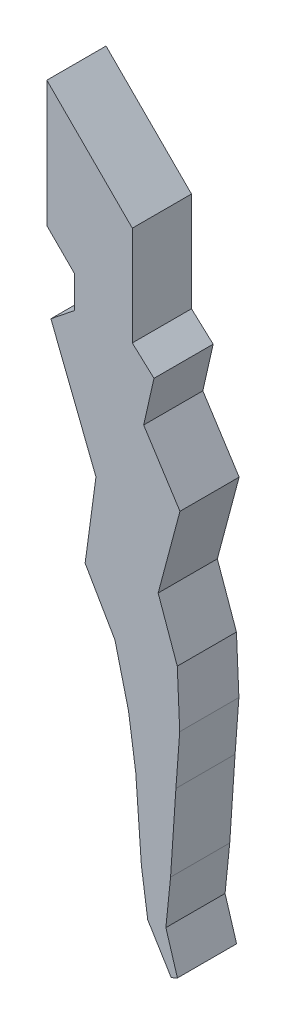
ISO-10303-21;
HEADER;
FILE_DESCRIPTION(('STEP AP214'),'2;1');
FILE_NAME('part.step','',(''),(''),'','','');
FILE_SCHEMA(('AUTOMOTIVE_DESIGN { 1 0 10303 214 1 1 1 1 }'));
ENDSEC;
DATA;
#1=APPLICATION_CONTEXT('core data for automotive mechanical design processes');
#2=APPLICATION_PROTOCOL_DEFINITION('international standard','automotive_design',2000,#1);
#3=PRODUCT_CONTEXT('',#1,'mechanical');
#4=PRODUCT('Part','Part','',(#3));
#5=PRODUCT_RELATED_PRODUCT_CATEGORY('part','',(#4));
#6=PRODUCT_DEFINITION_FORMATION('','',#4);
#7=PRODUCT_DEFINITION_CONTEXT('part definition',#1,'design');
#8=PRODUCT_DEFINITION('design','',#6,#7);
#9=PRODUCT_DEFINITION_SHAPE('','',#8);
#10=(LENGTH_UNIT() NAMED_UNIT(*) SI_UNIT(.MILLI.,.METRE.));
#11=(NAMED_UNIT(*) PLANE_ANGLE_UNIT() SI_UNIT($,.RADIAN.));
#12=(NAMED_UNIT(*) SI_UNIT($,.STERADIAN.) SOLID_ANGLE_UNIT());
#13=UNCERTAINTY_MEASURE_WITH_UNIT(LENGTH_MEASURE(1.E-05),#10,'distance_accuracy_value','');
#14=(GEOMETRIC_REPRESENTATION_CONTEXT(3) GLOBAL_UNCERTAINTY_ASSIGNED_CONTEXT((#13)) GLOBAL_UNIT_ASSIGNED_CONTEXT((#10,
#11,#12)) REPRESENTATION_CONTEXT('',''));
#15=CARTESIAN_POINT('',(0.,0.,0.));
#16=DIRECTION('',(0.,0.,1.));
#17=DIRECTION('',(1.,0.,0.));
#18=AXIS2_PLACEMENT_3D('',#15,#16,#17);
#19=CARTESIAN_POINT('',(4.431541,32.0453696437627,3.));
#20=DIRECTION('',(-0.707106781186548,-0.707106781186547,0.));
#21=DIRECTION('',(0.707106781186547,-0.707106781186548,0.));
#22=AXIS2_PLACEMENT_3D('',#19,#20,#21);
#23=PLANE('',#22);
#24=DIRECTION('',(-0.707106781186547,0.707106781186548,0.));
#25=VECTOR('',#24,1.);
#26=CARTESIAN_POINT('',(4.431541,32.0453696437627,0.));
#27=LINE('',#26,#25);
#28=CARTESIAN_POINT('',(4.431541,32.0453696437627,0.));
#29=VERTEX_POINT('',#28);
#30=CARTESIAN_POINT('',(0.1,36.3769106437627,0.));
#31=VERTEX_POINT('',#30);
#32=EDGE_CURVE('E231',#29,#31,#27,.T.);
#33=ORIENTED_EDGE('',*,*,#32,.T.);
#34=DIRECTION('',(0.,0.,-1.));
#35=VECTOR('',#34,1.);
#36=CARTESIAN_POINT('',(0.1,36.3769106437627,3.));
#37=LINE('',#36,#35);
#38=CARTESIAN_POINT('',(0.1,36.3769106437627,3.));
#39=VERTEX_POINT('',#38);
#40=EDGE_CURVE('E11',#39,#31,#37,.T.);
#41=ORIENTED_EDGE('',*,*,#40,.F.);
#42=DIRECTION('',(-0.707106781186547,0.707106781186548,0.));
#43=VECTOR('',#42,1.);
#44=CARTESIAN_POINT('',(4.431541,32.0453696437627,3.));
#45=LINE('',#44,#43);
#46=CARTESIAN_POINT('',(4.431541,32.0453696437627,3.));
#47=VERTEX_POINT('',#46);
#48=EDGE_CURVE('E279',#47,#39,#45,.T.);
#49=ORIENTED_EDGE('',*,*,#48,.F.);
#50=DIRECTION('',(0.,0.,-1.));
#51=VECTOR('',#50,1.);
#52=CARTESIAN_POINT('',(4.431541,32.0453696437627,3.));
#53=LINE('',#52,#51);
#54=EDGE_CURVE('E227',#47,#29,#53,.T.);
#55=ORIENTED_EDGE('',*,*,#54,.T.);
#56=EDGE_LOOP('',(#33,#41,#49,#55));
#57=FACE_BOUND('',#56,.T.);
#58=ADVANCED_FACE('F33',(#57),#23,.F.);
#59=CARTESIAN_POINT('',(0.1,36.3769106437627,3.));
#60=DIRECTION('',(1.,0.,0.));
#61=DIRECTION('',(0.,0.,-1.));
#62=AXIS2_PLACEMENT_3D('',#59,#60,#61);
#63=PLANE('',#62);
#64=DIRECTION('',(0.,-1.,0.));
#65=VECTOR('',#64,1.);
#66=CARTESIAN_POINT('',(0.1,36.3769106437627,0.));
#67=LINE('',#66,#65);
#68=CARTESIAN_POINT('',(0.1,29.9889453772979,0.));
#69=VERTEX_POINT('',#68);
#70=EDGE_CURVE('E234',#31,#69,#67,.T.);
#71=ORIENTED_EDGE('',*,*,#70,.T.);
#72=DIRECTION('',(0.,0.,-1.));
#73=VECTOR('',#72,1.);
#74=CARTESIAN_POINT('',(0.1,29.9889453772979,3.));
#75=LINE('',#74,#73);
#76=CARTESIAN_POINT('',(0.1,29.9889453772979,3.));
#77=VERTEX_POINT('',#76);
#78=EDGE_CURVE('E41',#77,#69,#75,.T.);
#79=ORIENTED_EDGE('',*,*,#78,.F.);
#80=DIRECTION('',(0.,-1.,0.));
#81=VECTOR('',#80,1.);
#82=CARTESIAN_POINT('',(0.1,36.3769106437627,3.));
#83=LINE('',#82,#81);
#84=EDGE_CURVE('E143',#39,#77,#83,.T.);
#85=ORIENTED_EDGE('',*,*,#84,.F.);
#86=ORIENTED_EDGE('',*,*,#40,.T.);
#87=EDGE_LOOP('',(#71,#79,#85,#86));
#88=FACE_BOUND('',#87,.T.);
#89=ADVANCED_FACE('F422',(#88),#63,.F.);
#90=CARTESIAN_POINT('',(0.1,29.9889453772979,3.));
#91=DIRECTION('',(0.707106526962772,0.707107035410231,0.));
#92=DIRECTION('',(-0.707107035410231,0.707106526962772,0.));
#93=AXIS2_PLACEMENT_3D('',#90,#91,#92);
#94=PLANE('',#93);
#95=DIRECTION('',(0.707107035410231,-0.707106526962772,0.));
#96=VECTOR('',#95,1.);
#97=CARTESIAN_POINT('',(0.1,29.9889453772979,0.));
#98=LINE('',#97,#96);
#99=CARTESIAN_POINT('',(1.490718,28.5982283772979,0.));
#100=VERTEX_POINT('',#99);
#101=EDGE_CURVE('E236',#69,#100,#98,.T.);
#102=ORIENTED_EDGE('',*,*,#101,.T.);
#103=DIRECTION('',(0.,0.,-1.));
#104=VECTOR('',#103,1.);
#105=CARTESIAN_POINT('',(1.490718,28.5982283772979,3.));
#106=LINE('',#105,#104);
#107=CARTESIAN_POINT('',(1.490718,28.5982283772979,3.));
#108=VERTEX_POINT('',#107);
#109=EDGE_CURVE('E337',#108,#100,#106,.T.);
#110=ORIENTED_EDGE('',*,*,#109,.F.);
#111=DIRECTION('',(0.707107035410231,-0.707106526962772,0.));
#112=VECTOR('',#111,1.);
#113=CARTESIAN_POINT('',(0.1,29.9889453772979,3.));
#114=LINE('',#113,#112);
#115=EDGE_CURVE('E345',#77,#108,#114,.T.);
#116=ORIENTED_EDGE('',*,*,#115,.F.);
#117=ORIENTED_EDGE('',*,*,#78,.T.);
#118=EDGE_LOOP('',(#102,#110,#116,#117));
#119=FACE_BOUND('',#118,.T.);
#120=ADVANCED_FACE('F343',(#119),#94,.F.);
#121=CARTESIAN_POINT('',(1.490718,28.5982283772979,3.));
#122=DIRECTION('',(1.,0.,0.));
#123=DIRECTION('',(0.,0.,-1.));
#124=AXIS2_PLACEMENT_3D('',#121,#122,#123);
#125=PLANE('',#124);
#126=DIRECTION('',(0.,-1.,0.));
#127=VECTOR('',#126,1.);
#128=CARTESIAN_POINT('',(1.490718,28.5982283772979,0.));
#129=LINE('',#128,#127);
#130=CARTESIAN_POINT('',(1.490718,26.9555668146788,0.));
#131=VERTEX_POINT('',#130);
#132=EDGE_CURVE('E238',#100,#131,#129,.T.);
#133=ORIENTED_EDGE('',*,*,#132,.T.);
#134=DIRECTION('',(0.,0.,-1.));
#135=VECTOR('',#134,1.);
#136=CARTESIAN_POINT('',(1.490718,26.9555668146788,3.));
#137=LINE('',#136,#135);
#138=CARTESIAN_POINT('',(1.490718,26.9555668146788,3.));
#139=VERTEX_POINT('',#138);
#140=EDGE_CURVE('E334',#139,#131,#137,.T.);
#141=ORIENTED_EDGE('',*,*,#140,.F.);
#142=DIRECTION('',(0.,-1.,0.));
#143=VECTOR('',#142,1.);
#144=CARTESIAN_POINT('',(1.490718,28.5982283772979,3.));
#145=LINE('',#144,#143);
#146=EDGE_CURVE('E363',#108,#139,#145,.T.);
#147=ORIENTED_EDGE('',*,*,#146,.F.);
#148=ORIENTED_EDGE('',*,*,#109,.T.);
#149=EDGE_LOOP('',(#133,#141,#147,#148));
#150=FACE_BOUND('',#149,.T.);
#151=ADVANCED_FACE('F354',(#150),#125,.F.);
#152=CARTESIAN_POINT('',(1.490718,26.9555668146788,3.));
#153=DIRECTION('',(0.625256998029095,-0.780418917258958,0.));
#154=DIRECTION('',(0.780418917258958,0.625256998029095,0.));
#155=AXIS2_PLACEMENT_3D('',#152,#153,#154);
#156=PLANE('',#155);
#157=DIRECTION('',(-0.780418917258958,-0.625256998029095,0.));
#158=VECTOR('',#157,1.);
#159=CARTESIAN_POINT('',(1.490718,26.9555668146788,0.));
#160=LINE('',#159,#158);
#161=CARTESIAN_POINT('',(0.305264988929706,26.0058040979962,0.));
#162=VERTEX_POINT('',#161);
#163=EDGE_CURVE('E240',#131,#162,#160,.T.);
#164=ORIENTED_EDGE('',*,*,#163,.T.);
#165=DIRECTION('',(0.,0.,-1.));
#166=VECTOR('',#165,1.);
#167=CARTESIAN_POINT('',(0.305264988929706,26.0058040979962,3.));
#168=LINE('',#167,#166);
#169=CARTESIAN_POINT('',(0.305264988929706,26.0058040979962,3.));
#170=VERTEX_POINT('',#169);
#171=EDGE_CURVE('E331',#170,#162,#168,.T.);
#172=ORIENTED_EDGE('',*,*,#171,.F.);
#173=DIRECTION('',(-0.780418917258958,-0.625256998029095,0.));
#174=VECTOR('',#173,1.);
#175=CARTESIAN_POINT('',(1.490718,26.9555668146788,3.));
#176=LINE('',#175,#174);
#177=EDGE_CURVE('E360',#139,#170,#176,.T.);
#178=ORIENTED_EDGE('',*,*,#177,.F.);
#179=ORIENTED_EDGE('',*,*,#140,.T.);
#180=EDGE_LOOP('',(#164,#172,#178,#179));
#181=FACE_BOUND('',#180,.T.);
#182=ADVANCED_FACE('F358',(#181),#156,.F.);
#183=CARTESIAN_POINT('',(0.305264988929706,26.0058040979962,3.));
#184=DIRECTION('',(0.930448288246611,0.366423229202177,0.));
#185=DIRECTION('',(-0.366423229202177,0.930448288246611,0.));
#186=AXIS2_PLACEMENT_3D('',#183,#184,#185);
#187=PLANE('',#186);
#188=DIRECTION('',(0.366423229202177,-0.930448288246611,0.));
#189=VECTOR('',#188,1.);
#190=CARTESIAN_POINT('',(0.305264988929706,26.0058040979962,0.));
#191=LINE('',#190,#189);
#192=CARTESIAN_POINT('',(2.58967106331305,20.2050754536958,0.));
#193=VERTEX_POINT('',#192);
#194=EDGE_CURVE('E242',#162,#193,#191,.T.);
#195=ORIENTED_EDGE('',*,*,#194,.T.);
#196=DIRECTION('',(0.,0.,-1.));
#197=VECTOR('',#196,1.);
#198=CARTESIAN_POINT('',(2.58967106331305,20.2050754536958,3.));
#199=LINE('',#198,#197);
#200=CARTESIAN_POINT('',(2.58967106331305,20.2050754536958,3.));
#201=VERTEX_POINT('',#200);
#202=EDGE_CURVE('E328',#201,#193,#199,.T.);
#203=ORIENTED_EDGE('',*,*,#202,.F.);
#204=DIRECTION('',(0.366423229202177,-0.930448288246611,0.));
#205=VECTOR('',#204,1.);
#206=CARTESIAN_POINT('',(0.305264988929706,26.0058040979962,3.));
#207=LINE('',#206,#205);
#208=EDGE_CURVE('E362',#170,#201,#207,.T.);
#209=ORIENTED_EDGE('',*,*,#208,.F.);
#210=ORIENTED_EDGE('',*,*,#171,.T.);
#211=EDGE_LOOP('',(#195,#203,#209,#210));
#212=FACE_BOUND('',#211,.T.);
#213=ADVANCED_FACE('F435',(#212),#187,.F.);
#214=CARTESIAN_POINT('',(2.58967106331305,20.2050754536958,3.));
#215=DIRECTION('',(0.990981389360942,-0.13399957440327,0.));
#216=DIRECTION('',(0.13399957440327,0.990981389360942,0.));
#217=AXIS2_PLACEMENT_3D('',#214,#215,#216);
#218=PLANE('',#217);
#219=DIRECTION('',(-0.13399957440327,-0.990981389360942,0.));
#220=VECTOR('',#219,1.);
#221=CARTESIAN_POINT('',(2.58967106331305,20.2050754536958,0.));
#222=LINE('',#221,#220);
#223=CARTESIAN_POINT('',(2.04009924758499,16.1407682054892,0.));
#224=VERTEX_POINT('',#223);
#225=EDGE_CURVE('E244',#193,#224,#222,.T.);
#226=ORIENTED_EDGE('',*,*,#225,.T.);
#227=DIRECTION('',(0.,0.,-1.));
#228=VECTOR('',#227,1.);
#229=CARTESIAN_POINT('',(2.04009924758499,16.1407682054892,3.));
#230=LINE('',#229,#228);
#231=CARTESIAN_POINT('',(2.04009924758499,16.1407682054892,3.));
#232=VERTEX_POINT('',#231);
#233=EDGE_CURVE('E325',#232,#224,#230,.T.);
#234=ORIENTED_EDGE('',*,*,#233,.F.);
#235=DIRECTION('',(-0.13399957440327,-0.990981389360942,0.));
#236=VECTOR('',#235,1.);
#237=CARTESIAN_POINT('',(2.58967106331305,20.2050754536958,3.));
#238=LINE('',#237,#236);
#239=EDGE_CURVE('E365',#201,#232,#238,.T.);
#240=ORIENTED_EDGE('',*,*,#239,.F.);
#241=ORIENTED_EDGE('',*,*,#202,.T.);
#242=EDGE_LOOP('',(#226,#234,#240,#241));
#243=FACE_BOUND('',#242,.T.);
#244=ADVANCED_FACE('F438',(#243),#218,.F.);
#245=CARTESIAN_POINT('',(2.04009924758499,16.1407682054892,3.));
#246=DIRECTION('',(0.865608287412153,0.500721771808856,0.));
#247=DIRECTION('',(-0.500721771808856,0.865608287412153,0.));
#248=AXIS2_PLACEMENT_3D('',#245,#246,#247);
#249=PLANE('',#248);
#250=DIRECTION('',(0.500721771808856,-0.865608287412153,0.));
#251=VECTOR('',#250,1.);
#252=CARTESIAN_POINT('',(2.04009924758499,16.1407682054892,0.));
#253=LINE('',#252,#251);
#254=CARTESIAN_POINT('',(3.55196525050998,13.5271735601816,0.));
#255=VERTEX_POINT('',#254);
#256=EDGE_CURVE('E246',#224,#255,#253,.T.);
#257=ORIENTED_EDGE('',*,*,#256,.T.);
#258=DIRECTION('',(0.,0.,-1.));
#259=VECTOR('',#258,1.);
#260=CARTESIAN_POINT('',(3.55196525050998,13.5271735601816,3.));
#261=LINE('',#260,#259);
#262=CARTESIAN_POINT('',(3.55196525050998,13.5271735601816,3.));
#263=VERTEX_POINT('',#262);
#264=EDGE_CURVE('E322',#263,#255,#261,.T.);
#265=ORIENTED_EDGE('',*,*,#264,.F.);
#266=DIRECTION('',(0.500721771808856,-0.865608287412153,0.));
#267=VECTOR('',#266,1.);
#268=CARTESIAN_POINT('',(2.04009924758499,16.1407682054892,3.));
#269=LINE('',#268,#267);
#270=EDGE_CURVE('E371',#232,#263,#269,.T.);
#271=ORIENTED_EDGE('',*,*,#270,.F.);
#272=ORIENTED_EDGE('',*,*,#233,.T.);
#273=EDGE_LOOP('',(#257,#265,#271,#272));
#274=FACE_BOUND('',#273,.T.);
#275=ADVANCED_FACE('F442',(#274),#249,.F.);
#276=CARTESIAN_POINT('',(3.55196525050998,13.5271735601816,3.));
#277=DIRECTION('',(0.970484456484513,0.241163678280873,0.));
#278=DIRECTION('',(-0.241163678280873,0.970484456484513,0.));
#279=AXIS2_PLACEMENT_3D('',#276,#277,#278);
#280=PLANE('',#279);
#281=DIRECTION('',(0.241163678280873,-0.970484456484512,0.));
#282=VECTOR('',#281,1.);
#283=CARTESIAN_POINT('',(3.55196525050998,13.5271735601816,0.));
#284=LINE('',#283,#282);
#285=CARTESIAN_POINT('',(4.24063457657345,10.7558487845498,0.));
#286=VERTEX_POINT('',#285);
#287=EDGE_CURVE('E248',#255,#286,#284,.T.);
#288=ORIENTED_EDGE('',*,*,#287,.T.);
#289=DIRECTION('',(0.,0.,-1.));
#290=VECTOR('',#289,1.);
#291=CARTESIAN_POINT('',(4.24063457657345,10.7558487845498,3.));
#292=LINE('',#291,#290);
#293=CARTESIAN_POINT('',(4.24063457657345,10.7558487845498,3.));
#294=VERTEX_POINT('',#293);
#295=EDGE_CURVE('E319',#294,#286,#292,.T.);
#296=ORIENTED_EDGE('',*,*,#295,.F.);
#297=DIRECTION('',(0.241163678280873,-0.970484456484512,0.));
#298=VECTOR('',#297,1.);
#299=CARTESIAN_POINT('',(3.55196525050998,13.5271735601816,3.));
#300=LINE('',#299,#298);
#301=EDGE_CURVE('E373',#263,#294,#300,.T.);
#302=ORIENTED_EDGE('',*,*,#301,.F.);
#303=ORIENTED_EDGE('',*,*,#264,.T.);
#304=EDGE_LOOP('',(#288,#296,#302,#303));
#305=FACE_BOUND('',#304,.T.);
#306=ADVANCED_FACE('F446',(#305),#280,.F.);
#307=CARTESIAN_POINT('',(4.24063457657345,10.7558487845498,3.));
#308=DIRECTION('',(0.989656647554641,0.143456334648939,0.));
#309=DIRECTION('',(-0.143456334648939,0.989656647554642,0.));
#310=AXIS2_PLACEMENT_3D('',#307,#308,#309);
#311=PLANE('',#310);
#312=DIRECTION('',(0.143456334648939,-0.989656647554641,0.));
#313=VECTOR('',#312,1.);
#314=CARTESIAN_POINT('',(4.24063457657345,10.7558487845498,0.));
#315=LINE('',#314,#313);
#316=CARTESIAN_POINT('',(4.60621300008909,8.23384710424643,0.));
#317=VERTEX_POINT('',#316);
#318=EDGE_CURVE('E250',#286,#317,#315,.T.);
#319=ORIENTED_EDGE('',*,*,#318,.T.);
#320=DIRECTION('',(0.,0.,-1.));
#321=VECTOR('',#320,1.);
#322=CARTESIAN_POINT('',(4.60621300008909,8.23384710424643,3.));
#323=LINE('',#322,#321);
#324=CARTESIAN_POINT('',(4.60621300008909,8.23384710424643,3.));
#325=VERTEX_POINT('',#324);
#326=EDGE_CURVE('E316',#325,#317,#323,.T.);
#327=ORIENTED_EDGE('',*,*,#326,.F.);
#328=DIRECTION('',(0.143456334648939,-0.989656647554641,0.));
#329=VECTOR('',#328,1.);
#330=CARTESIAN_POINT('',(4.24063457657345,10.7558487845498,3.));
#331=LINE('',#330,#329);
#332=EDGE_CURVE('E375',#294,#325,#331,.T.);
#333=ORIENTED_EDGE('',*,*,#332,.F.);
#334=ORIENTED_EDGE('',*,*,#295,.T.);
#335=EDGE_LOOP('',(#319,#327,#333,#334));
#336=FACE_BOUND('',#335,.T.);
#337=ADVANCED_FACE('F450',(#336),#311,.F.);
#338=CARTESIAN_POINT('',(4.60621300008909,8.23384710424643,3.));
#339=DIRECTION('',(0.997358865679586,0.0726312126453135,0.));
#340=DIRECTION('',(-0.0726312126453135,0.997358865679586,0.));
#341=AXIS2_PLACEMENT_3D('',#338,#339,#340);
#342=PLANE('',#341);
#343=DIRECTION('',(0.0726312126453135,-0.997358865679586,0.));
#344=VECTOR('',#343,1.);
#345=CARTESIAN_POINT('',(4.60621300008909,8.23384710424643,0.));
#346=LINE('',#345,#344);
#347=CARTESIAN_POINT('',(4.89394744160751,4.28272904139407,0.));
#348=VERTEX_POINT('',#347);
#349=EDGE_CURVE('E252',#317,#348,#346,.T.);
#350=ORIENTED_EDGE('',*,*,#349,.T.);
#351=DIRECTION('',(0.,0.,-1.));
#352=VECTOR('',#351,1.);
#353=CARTESIAN_POINT('',(4.89394744160751,4.28272904139407,3.));
#354=LINE('',#353,#352);
#355=CARTESIAN_POINT('',(4.89394744160751,4.28272904139407,3.));
#356=VERTEX_POINT('',#355);
#357=EDGE_CURVE('E313',#356,#348,#354,.T.);
#358=ORIENTED_EDGE('',*,*,#357,.F.);
#359=DIRECTION('',(0.0726312126453135,-0.997358865679586,0.));
#360=VECTOR('',#359,1.);
#361=CARTESIAN_POINT('',(4.60621300008909,8.23384710424643,3.));
#362=LINE('',#361,#360);
#363=EDGE_CURVE('E377',#325,#356,#362,.T.);
#364=ORIENTED_EDGE('',*,*,#363,.F.);
#365=ORIENTED_EDGE('',*,*,#326,.T.);
#366=EDGE_LOOP('',(#350,#358,#364,#365));
#367=FACE_BOUND('',#366,.T.);
#368=ADVANCED_FACE('F454',(#367),#342,.F.);
#369=CARTESIAN_POINT('',(4.89394744160751,4.28272904139407,3.));
#370=DIRECTION('',(0.989674059321828,0.143336165378648,0.));
#371=DIRECTION('',(-0.143336165378648,0.989674059321828,0.));
#372=AXIS2_PLACEMENT_3D('',#369,#370,#371);
#373=PLANE('',#372);
#374=DIRECTION('',(0.143336165378648,-0.989674059321828,0.));
#375=VECTOR('',#374,1.);
#376=CARTESIAN_POINT('',(4.89394744160751,4.28272904139407,0.));
#377=LINE('',#376,#375);
#378=CARTESIAN_POINT('',(5.21405761551797,2.07250711723916,0.));
#379=VERTEX_POINT('',#378);
#380=EDGE_CURVE('E254',#348,#379,#377,.T.);
#381=ORIENTED_EDGE('',*,*,#380,.T.);
#382=DIRECTION('',(0.,0.,-1.));
#383=VECTOR('',#382,1.);
#384=CARTESIAN_POINT('',(5.21405761551797,2.07250711723916,3.));
#385=LINE('',#384,#383);
#386=CARTESIAN_POINT('',(5.21405761551797,2.07250711723916,3.));
#387=VERTEX_POINT('',#386);
#388=EDGE_CURVE('E310',#387,#379,#385,.T.);
#389=ORIENTED_EDGE('',*,*,#388,.F.);
#390=DIRECTION('',(0.143336165378648,-0.989674059321828,0.));
#391=VECTOR('',#390,1.);
#392=CARTESIAN_POINT('',(4.89394744160751,4.28272904139407,3.));
#393=LINE('',#392,#391);
#394=EDGE_CURVE('E379',#356,#387,#393,.T.);
#395=ORIENTED_EDGE('',*,*,#394,.F.);
#396=ORIENTED_EDGE('',*,*,#357,.T.);
#397=EDGE_LOOP('',(#381,#389,#395,#396));
#398=FACE_BOUND('',#397,.T.);
#399=ADVANCED_FACE('F458',(#398),#373,.F.);
#400=CARTESIAN_POINT('',(5.21405761551797,2.07250711723916,3.));
#401=DIRECTION('',(0.853002136465464,0.52190742012866,0.));
#402=DIRECTION('',(-0.52190742012866,0.853002136465465,0.));
#403=AXIS2_PLACEMENT_3D('',#400,#401,#402);
#404=PLANE('',#403);
#405=DIRECTION('',(0.52190742012866,-0.853002136465464,0.));
#406=VECTOR('',#405,1.);
#407=CARTESIAN_POINT('',(5.21405761551797,2.07250711723916,0.));
#408=LINE('',#407,#406);
#409=CARTESIAN_POINT('',(6.40407987921905,0.127542370180668,0.));
#410=VERTEX_POINT('',#409);
#411=EDGE_CURVE('E256',#379,#410,#408,.T.);
#412=ORIENTED_EDGE('',*,*,#411,.T.);
#413=DIRECTION('',(0.,0.,-1.));
#414=VECTOR('',#413,1.);
#415=CARTESIAN_POINT('',(6.40407987921905,0.127542370180668,3.));
#416=LINE('',#415,#414);
#417=CARTESIAN_POINT('',(6.40407987921905,0.127542370180668,3.));
#418=VERTEX_POINT('',#417);
#419=EDGE_CURVE('E307',#418,#410,#416,.T.);
#420=ORIENTED_EDGE('',*,*,#419,.F.);
#421=DIRECTION('',(0.52190742012866,-0.853002136465464,0.));
#422=VECTOR('',#421,1.);
#423=CARTESIAN_POINT('',(5.21405761551797,2.07250711723916,3.));
#424=LINE('',#423,#422);
#425=EDGE_CURVE('E381',#387,#418,#424,.T.);
#426=ORIENTED_EDGE('',*,*,#425,.F.);
#427=ORIENTED_EDGE('',*,*,#388,.T.);
#428=EDGE_LOOP('',(#412,#420,#426,#427));
#429=FACE_BOUND('',#428,.T.);
#430=ADVANCED_FACE('F462',(#429),#404,.F.);
#431=CARTESIAN_POINT('',(6.40407987921905,0.127542370180668,3.));
#432=DIRECTION('',(-0.412688749506975,0.910872107395088,0.));
#433=DIRECTION('',(-0.910872107395088,-0.412688749506975,0.));
#434=AXIS2_PLACEMENT_3D('',#431,#432,#433);
#435=PLANE('',#434);
#436=DIRECTION('',(0.910872107395089,0.412688749506975,0.));
#437=VECTOR('',#436,1.);
#438=CARTESIAN_POINT('',(6.40407987921905,0.127542370180668,0.));
#439=LINE('',#438,#437);
#440=CARTESIAN_POINT('',(6.71930092959634,0.270359545108228,0.));
#441=VERTEX_POINT('',#440);
#442=EDGE_CURVE('E258',#410,#441,#439,.T.);
#443=ORIENTED_EDGE('',*,*,#442,.T.);
#444=DIRECTION('',(0.,0.,-1.));
#445=VECTOR('',#444,1.);
#446=CARTESIAN_POINT('',(6.71930092959634,0.270359545108228,3.));
#447=LINE('',#446,#445);
#448=CARTESIAN_POINT('',(6.71930092959634,0.270359545108228,3.));
#449=VERTEX_POINT('',#448);
#450=EDGE_CURVE('E304',#449,#441,#447,.T.);
#451=ORIENTED_EDGE('',*,*,#450,.F.);
#452=DIRECTION('',(0.910872107395089,0.412688749506975,0.));
#453=VECTOR('',#452,1.);
#454=CARTESIAN_POINT('',(6.40407987921905,0.127542370180668,3.));
#455=LINE('',#454,#453);
#456=EDGE_CURVE('E383',#418,#449,#455,.T.);
#457=ORIENTED_EDGE('',*,*,#456,.F.);
#458=ORIENTED_EDGE('',*,*,#419,.T.);
#459=EDGE_LOOP('',(#443,#451,#457,#458));
#460=FACE_BOUND('',#459,.T.);
#461=ADVANCED_FACE('F466',(#460),#435,.F.);
#462=CARTESIAN_POINT('',(6.71930092959634,0.270359545108228,3.));
#463=DIRECTION('',(-0.95647743048352,-0.291806314146289,0.));
#464=DIRECTION('',(0.291806314146289,-0.95647743048352,0.));
#465=AXIS2_PLACEMENT_3D('',#462,#463,#464);
#466=PLANE('',#465);
#467=DIRECTION('',(-0.291806314146289,0.95647743048352,0.));
#468=VECTOR('',#467,1.);
#469=CARTESIAN_POINT('',(6.71930092959634,0.270359545108228,0.));
#470=LINE('',#469,#468);
#471=CARTESIAN_POINT('',(6.13382696619427,2.18941545645182,0.));
#472=VERTEX_POINT('',#471);
#473=EDGE_CURVE('E260',#441,#472,#470,.T.);
#474=ORIENTED_EDGE('',*,*,#473,.T.);
#475=DIRECTION('',(0.,0.,-1.));
#476=VECTOR('',#475,1.);
#477=CARTESIAN_POINT('',(6.13382696619427,2.18941545645182,3.));
#478=LINE('',#477,#476);
#479=CARTESIAN_POINT('',(6.13382696619427,2.18941545645182,3.));
#480=VERTEX_POINT('',#479);
#481=EDGE_CURVE('E301',#480,#472,#478,.T.);
#482=ORIENTED_EDGE('',*,*,#481,.F.);
#483=DIRECTION('',(-0.291806314146289,0.95647743048352,0.));
#484=VECTOR('',#483,1.);
#485=CARTESIAN_POINT('',(6.71930092959634,0.270359545108228,3.));
#486=LINE('',#485,#484);
#487=EDGE_CURVE('E385',#449,#480,#486,.T.);
#488=ORIENTED_EDGE('',*,*,#487,.F.);
#489=ORIENTED_EDGE('',*,*,#450,.T.);
#490=EDGE_LOOP('',(#474,#482,#488,#489));
#491=FACE_BOUND('',#490,.T.);
#492=ADVANCED_FACE('F470',(#491),#466,.F.);
#493=CARTESIAN_POINT('',(6.13382696619427,2.18941545645182,3.));
#494=DIRECTION('',(-0.994897875856503,0.100887147923902,0.));
#495=DIRECTION('',(-0.100887147923902,-0.994897875856503,0.));
#496=AXIS2_PLACEMENT_3D('',#493,#494,#495);
#497=PLANE('',#496);
#498=DIRECTION('',(0.100887147923902,0.994897875856502,0.));
#499=VECTOR('',#498,1.);
#500=CARTESIAN_POINT('',(6.13382696619427,2.18941545645182,0.));
#501=LINE('',#500,#499);
#502=CARTESIAN_POINT('',(6.37050423284627,4.52340660102472,0.));
#503=VERTEX_POINT('',#502);
#504=EDGE_CURVE('E262',#472,#503,#501,.T.);
#505=ORIENTED_EDGE('',*,*,#504,.T.);
#506=DIRECTION('',(0.,0.,-1.));
#507=VECTOR('',#506,1.);
#508=CARTESIAN_POINT('',(6.37050423284627,4.52340660102472,3.));
#509=LINE('',#508,#507);
#510=CARTESIAN_POINT('',(6.37050423284627,4.52340660102472,3.));
#511=VERTEX_POINT('',#510);
#512=EDGE_CURVE('E298',#511,#503,#509,.T.);
#513=ORIENTED_EDGE('',*,*,#512,.F.);
#514=DIRECTION('',(0.100887147923902,0.994897875856502,0.));
#515=VECTOR('',#514,1.);
#516=CARTESIAN_POINT('',(6.13382696619427,2.18941545645182,3.));
#517=LINE('',#516,#515);
#518=EDGE_CURVE('E387',#480,#511,#517,.T.);
#519=ORIENTED_EDGE('',*,*,#518,.F.);
#520=ORIENTED_EDGE('',*,*,#481,.T.);
#521=EDGE_LOOP('',(#505,#513,#519,#520));
#522=FACE_BOUND('',#521,.T.);
#523=ADVANCED_FACE('F474',(#522),#497,.F.);
#524=CARTESIAN_POINT('',(6.37050423284627,4.52340660102472,3.));
#525=DIRECTION('',(-0.997745137571752,0.0671166182992415,0.));
#526=DIRECTION('',(-0.0671166182992415,-0.997745137571752,0.));
#527=AXIS2_PLACEMENT_3D('',#524,#525,#526);
#528=PLANE('',#527);
#529=DIRECTION('',(0.0671166182992415,0.997745137571752,0.));
#530=VECTOR('',#529,1.);
#531=CARTESIAN_POINT('',(6.37050423284627,4.52340660102472,0.));
#532=LINE('',#531,#530);
#533=CARTESIAN_POINT('',(6.64161357550973,8.55367563494288,0.));
#534=VERTEX_POINT('',#533);
#535=EDGE_CURVE('E264',#503,#534,#532,.T.);
#536=ORIENTED_EDGE('',*,*,#535,.T.);
#537=DIRECTION('',(0.,0.,-1.));
#538=VECTOR('',#537,1.);
#539=CARTESIAN_POINT('',(6.64161357550973,8.55367563494288,3.));
#540=LINE('',#539,#538);
#541=CARTESIAN_POINT('',(6.64161357550973,8.55367563494288,3.));
#542=VERTEX_POINT('',#541);
#543=EDGE_CURVE('E295',#542,#534,#540,.T.);
#544=ORIENTED_EDGE('',*,*,#543,.F.);
#545=DIRECTION('',(0.0671166182992415,0.997745137571752,0.));
#546=VECTOR('',#545,1.);
#547=CARTESIAN_POINT('',(6.37050423284627,4.52340660102472,3.));
#548=LINE('',#547,#546);
#549=EDGE_CURVE('E389',#511,#542,#548,.T.);
#550=ORIENTED_EDGE('',*,*,#549,.F.);
#551=ORIENTED_EDGE('',*,*,#512,.T.);
#552=EDGE_LOOP('',(#536,#544,#550,#551));
#553=FACE_BOUND('',#552,.T.);
#554=ADVANCED_FACE('F478',(#553),#528,.F.);
#555=CARTESIAN_POINT('',(6.64161357550973,8.55367563494288,3.));
#556=DIRECTION('',(-0.997215474970495,0.0745741005937689,0.));
#557=DIRECTION('',(-0.0745741005937689,-0.997215474970495,0.));
#558=AXIS2_PLACEMENT_3D('',#555,#556,#557);
#559=PLANE('',#558);
#560=DIRECTION('',(0.0745741005937689,0.997215474970495,0.));
#561=VECTOR('',#560,1.);
#562=CARTESIAN_POINT('',(6.64161357550973,8.55367563494288,0.));
#563=LINE('',#562,#561);
#564=CARTESIAN_POINT('',(6.83522607422338,11.1426894926721,0.));
#565=VERTEX_POINT('',#564);
#566=EDGE_CURVE('E266',#534,#565,#563,.T.);
#567=ORIENTED_EDGE('',*,*,#566,.T.);
#568=DIRECTION('',(0.,0.,-1.));
#569=VECTOR('',#568,1.);
#570=CARTESIAN_POINT('',(6.83522607422338,11.1426894926721,3.));
#571=LINE('',#570,#569);
#572=CARTESIAN_POINT('',(6.83522607422338,11.1426894926721,3.));
#573=VERTEX_POINT('',#572);
#574=EDGE_CURVE('E292',#573,#565,#571,.T.);
#575=ORIENTED_EDGE('',*,*,#574,.F.);
#576=DIRECTION('',(0.0745741005937689,0.997215474970495,0.));
#577=VECTOR('',#576,1.);
#578=CARTESIAN_POINT('',(6.64161357550973,8.55367563494288,3.));
#579=LINE('',#578,#577);
#580=EDGE_CURVE('E391',#542,#573,#579,.T.);
#581=ORIENTED_EDGE('',*,*,#580,.F.);
#582=ORIENTED_EDGE('',*,*,#543,.T.);
#583=EDGE_LOOP('',(#567,#575,#581,#582));
#584=FACE_BOUND('',#583,.T.);
#585=ADVANCED_FACE('F482',(#584),#559,.F.);
#586=CARTESIAN_POINT('',(6.83522607422338,11.1426894926721,3.));
#587=DIRECTION('',(-0.999026595198034,-0.0441119268115097,0.));
#588=DIRECTION('',(0.0441119268115098,-0.999026595198034,0.));
#589=AXIS2_PLACEMENT_3D('',#586,#587,#588);
#590=PLANE('',#589);
#591=DIRECTION('',(-0.0441119268115097,0.999026595198034,0.));
#592=VECTOR('',#591,1.);
#593=CARTESIAN_POINT('',(6.83522607422338,11.1426894926721,0.));
#594=LINE('',#593,#592);
#595=CARTESIAN_POINT('',(6.71102282061841,13.9555875574447,0.));
#596=VERTEX_POINT('',#595);
#597=EDGE_CURVE('E268',#565,#596,#594,.T.);
#598=ORIENTED_EDGE('',*,*,#597,.T.);
#599=DIRECTION('',(0.,0.,-1.));
#600=VECTOR('',#599,1.);
#601=CARTESIAN_POINT('',(6.71102282061841,13.9555875574447,3.));
#602=LINE('',#601,#600);
#603=CARTESIAN_POINT('',(6.71102282061841,13.9555875574447,3.));
#604=VERTEX_POINT('',#603);
#605=EDGE_CURVE('E289',#604,#596,#602,.T.);
#606=ORIENTED_EDGE('',*,*,#605,.F.);
#607=DIRECTION('',(-0.0441119268115097,0.999026595198034,0.));
#608=VECTOR('',#607,1.);
#609=CARTESIAN_POINT('',(6.83522607422338,11.1426894926721,3.));
#610=LINE('',#609,#608);
#611=EDGE_CURVE('E393',#573,#604,#610,.T.);
#612=ORIENTED_EDGE('',*,*,#611,.F.);
#613=ORIENTED_EDGE('',*,*,#574,.T.);
#614=EDGE_LOOP('',(#598,#606,#612,#613));
#615=FACE_BOUND('',#614,.T.);
#616=ADVANCED_FACE('F486',(#615),#590,.F.);
#617=CARTESIAN_POINT('',(6.71102282061841,13.9555875574447,3.));
#618=DIRECTION('',(-0.942295373982806,-0.334782658109113,0.));
#619=DIRECTION('',(0.334782658109113,-0.942295373982806,0.));
#620=AXIS2_PLACEMENT_3D('',#617,#618,#619);
#621=PLANE('',#620);
#622=DIRECTION('',(-0.334782658109113,0.942295373982806,0.));
#623=VECTOR('',#622,1.);
#624=CARTESIAN_POINT('',(6.71102282061841,13.9555875574447,0.));
#625=LINE('',#624,#623);
#626=CARTESIAN_POINT('',(5.74211308505323,16.6827275078432,0.));
#627=VERTEX_POINT('',#626);
#628=EDGE_CURVE('E270',#596,#627,#625,.T.);
#629=ORIENTED_EDGE('',*,*,#628,.T.);
#630=DIRECTION('',(0.,0.,-1.));
#631=VECTOR('',#630,1.);
#632=CARTESIAN_POINT('',(5.74211308505323,16.6827275078432,3.));
#633=LINE('',#632,#631);
#634=CARTESIAN_POINT('',(5.74211308505323,16.6827275078432,3.));
#635=VERTEX_POINT('',#634);
#636=EDGE_CURVE('E286',#635,#627,#633,.T.);
#637=ORIENTED_EDGE('',*,*,#636,.F.);
#638=DIRECTION('',(-0.334782658109113,0.942295373982806,0.));
#639=VECTOR('',#638,1.);
#640=CARTESIAN_POINT('',(6.71102282061841,13.9555875574447,3.));
#641=LINE('',#640,#639);
#642=EDGE_CURVE('E395',#604,#635,#641,.T.);
#643=ORIENTED_EDGE('',*,*,#642,.F.);
#644=ORIENTED_EDGE('',*,*,#605,.T.);
#645=EDGE_LOOP('',(#629,#637,#643,#644));
#646=FACE_BOUND('',#645,.T.);
#647=ADVANCED_FACE('F490',(#646),#621,.F.);
#648=CARTESIAN_POINT('',(5.74211308505323,16.6827275078432,3.));
#649=DIRECTION('',(-0.966149724222239,0.25798199624255,0.));
#650=DIRECTION('',(-0.25798199624255,-0.966149724222239,0.));
#651=AXIS2_PLACEMENT_3D('',#648,#649,#650);
#652=PLANE('',#651);
#653=DIRECTION('',(0.25798199624255,0.966149724222239,0.));
#654=VECTOR('',#653,1.);
#655=CARTESIAN_POINT('',(5.74211308505323,16.6827275078432,0.));
#656=LINE('',#655,#654);
#657=CARTESIAN_POINT('',(6.84778262380069,20.8234905668958,0.));
#658=VERTEX_POINT('',#657);
#659=EDGE_CURVE('E272',#627,#658,#656,.T.);
#660=ORIENTED_EDGE('',*,*,#659,.T.);
#661=DIRECTION('',(0.,0.,-1.));
#662=VECTOR('',#661,1.);
#663=CARTESIAN_POINT('',(6.84778262380069,20.8234905668958,3.));
#664=LINE('',#663,#662);
#665=CARTESIAN_POINT('',(6.84778262380069,20.8234905668958,3.));
#666=VERTEX_POINT('',#665);
#667=EDGE_CURVE('E283',#666,#658,#664,.T.);
#668=ORIENTED_EDGE('',*,*,#667,.F.);
#669=DIRECTION('',(0.25798199624255,0.966149724222239,0.));
#670=VECTOR('',#669,1.);
#671=CARTESIAN_POINT('',(5.74211308505323,16.6827275078432,3.));
#672=LINE('',#671,#670);
#673=EDGE_CURVE('E397',#635,#666,#672,.T.);
#674=ORIENTED_EDGE('',*,*,#673,.F.);
#675=ORIENTED_EDGE('',*,*,#636,.T.);
#676=EDGE_LOOP('',(#660,#668,#674,#675));
#677=FACE_BOUND('',#676,.T.);
#678=ADVANCED_FACE('F403',(#677),#652,.F.);
#679=CARTESIAN_POINT('',(6.84778262380069,20.8234905668958,3.));
#680=DIRECTION('',(-0.841598473907753,-0.540103701816736,0.));
#681=DIRECTION('',(0.540103701816736,-0.841598473907753,0.));
#682=AXIS2_PLACEMENT_3D('',#679,#680,#681);
#683=PLANE('',#682);
#684=DIRECTION('',(-0.540103701816736,0.841598473907753,0.));
#685=VECTOR('',#684,1.);
#686=CARTESIAN_POINT('',(6.84778262380069,20.8234905668958,0.));
#687=LINE('',#686,#685);
#688=CARTESIAN_POINT('',(5.00739850672144,23.6912073759606,0.));
#689=VERTEX_POINT('',#688);
#690=EDGE_CURVE('E274',#658,#689,#687,.T.);
#691=ORIENTED_EDGE('',*,*,#690,.T.);
#692=DIRECTION('',(0.,0.,-1.));
#693=VECTOR('',#692,1.);
#694=CARTESIAN_POINT('',(5.00739850672144,23.6912073759606,3.));
#695=LINE('',#694,#693);
#696=CARTESIAN_POINT('',(5.00739850672144,23.6912073759606,3.));
#697=VERTEX_POINT('',#696);
#698=EDGE_CURVE('E222',#697,#689,#695,.T.);
#699=ORIENTED_EDGE('',*,*,#698,.F.);
#700=DIRECTION('',(-0.540103701816736,0.841598473907753,0.));
#701=VECTOR('',#700,1.);
#702=CARTESIAN_POINT('',(6.84778262380069,20.8234905668958,3.));
#703=LINE('',#702,#701);
#704=EDGE_CURVE('E213',#666,#697,#703,.T.);
#705=ORIENTED_EDGE('',*,*,#704,.F.);
#706=ORIENTED_EDGE('',*,*,#667,.T.);
#707=EDGE_LOOP('',(#691,#699,#705,#706));
#708=FACE_BOUND('',#707,.T.);
#709=ADVANCED_FACE('F407',(#708),#683,.F.);
#710=CARTESIAN_POINT('',(5.00739850672144,23.6912073759606,3.));
#711=DIRECTION('',(-0.975320926229071,0.220791962851159,0.));
#712=DIRECTION('',(-0.220791962851159,-0.975320926229071,0.));
#713=AXIS2_PLACEMENT_3D('',#710,#711,#712);
#714=PLANE('',#713);
#715=DIRECTION('',(0.220791962851159,0.975320926229071,0.));
#716=VECTOR('',#715,1.);
#717=CARTESIAN_POINT('',(5.00739850672144,23.6912073759606,0.));
#718=LINE('',#717,#716);
#719=CARTESIAN_POINT('',(5.53076121791143,26.0030968018256,0.));
#720=VERTEX_POINT('',#719);
#721=EDGE_CURVE('E221',#689,#720,#718,.T.);
#722=ORIENTED_EDGE('',*,*,#721,.T.);
#723=DIRECTION('',(0.,0.,-1.));
#724=VECTOR('',#723,1.);
#725=CARTESIAN_POINT('',(5.53076121791143,26.0030968018256,3.));
#726=LINE('',#725,#724);
#727=CARTESIAN_POINT('',(5.53076121791143,26.0030968018256,3.));
#728=VERTEX_POINT('',#727);
#729=EDGE_CURVE('E218',#728,#720,#726,.T.);
#730=ORIENTED_EDGE('',*,*,#729,.F.);
#731=DIRECTION('',(0.220791962851159,0.975320926229071,0.));
#732=VECTOR('',#731,1.);
#733=CARTESIAN_POINT('',(5.00739850672144,23.6912073759606,3.));
#734=LINE('',#733,#732);
#735=EDGE_CURVE('E207',#697,#728,#734,.T.);
#736=ORIENTED_EDGE('',*,*,#735,.F.);
#737=ORIENTED_EDGE('',*,*,#698,.T.);
#738=EDGE_LOOP('',(#722,#730,#736,#737));
#739=FACE_BOUND('',#738,.T.);
#740=ADVANCED_FACE('F219',(#739),#714,.F.);
#741=CARTESIAN_POINT('',(5.53076121791143,26.0030968018256,3.));
#742=DIRECTION('',(-0.674064796881825,-0.738672220680231,0.));
#743=DIRECTION('',(0.738672220680231,-0.674064796881825,0.));
#744=AXIS2_PLACEMENT_3D('',#741,#742,#743);
#745=PLANE('',#744);
#746=DIRECTION('',(-0.738672220680231,0.674064796881825,0.));
#747=VECTOR('',#746,1.);
#748=CARTESIAN_POINT('',(5.53076121791143,26.0030968018256,0.));
#749=LINE('',#748,#747);
#750=CARTESIAN_POINT('',(4.431541,27.0061745299045,0.));
#751=VERTEX_POINT('',#750);
#752=EDGE_CURVE('E129',#720,#751,#749,.T.);
#753=ORIENTED_EDGE('',*,*,#752,.T.);
#754=DIRECTION('',(0.,0.,-1.));
#755=VECTOR('',#754,1.);
#756=CARTESIAN_POINT('',(4.431541,27.0061745299045,3.));
#757=LINE('',#756,#755);
#758=CARTESIAN_POINT('',(4.431541,27.0061745299045,3.));
#759=VERTEX_POINT('',#758);
#760=EDGE_CURVE('E223',#759,#751,#757,.T.);
#761=ORIENTED_EDGE('',*,*,#760,.F.);
#762=DIRECTION('',(-0.738672220680231,0.674064796881825,0.));
#763=VECTOR('',#762,1.);
#764=CARTESIAN_POINT('',(5.53076121791143,26.0030968018256,3.));
#765=LINE('',#764,#763);
#766=EDGE_CURVE('E211',#728,#759,#765,.T.);
#767=ORIENTED_EDGE('',*,*,#766,.F.);
#768=ORIENTED_EDGE('',*,*,#729,.T.);
#769=EDGE_LOOP('',(#753,#761,#767,#768));
#770=FACE_BOUND('',#769,.T.);
#771=ADVANCED_FACE('F225',(#770),#745,.F.);
#772=CARTESIAN_POINT('',(4.431541,27.0061745299045,3.));
#773=DIRECTION('',(-1.,0.,0.));
#774=DIRECTION('',(0.,0.,1.));
#775=AXIS2_PLACEMENT_3D('',#772,#773,#774);
#776=PLANE('',#775);
#777=DIRECTION('',(0.,1.,0.));
#778=VECTOR('',#777,1.);
#779=CARTESIAN_POINT('',(4.431541,27.0061745299045,0.));
#780=LINE('',#779,#778);
#781=EDGE_CURVE('E135',#751,#29,#780,.T.);
#782=ORIENTED_EDGE('',*,*,#781,.T.);
#783=ORIENTED_EDGE('',*,*,#54,.F.);
#784=DIRECTION('',(0.,1.,0.));
#785=VECTOR('',#784,1.);
#786=CARTESIAN_POINT('',(4.431541,27.0061745299045,3.));
#787=LINE('',#786,#785);
#788=EDGE_CURVE('E49',#759,#47,#787,.T.);
#789=ORIENTED_EDGE('',*,*,#788,.F.);
#790=ORIENTED_EDGE('',*,*,#760,.T.);
#791=EDGE_LOOP('',(#782,#783,#789,#790));
#792=FACE_BOUND('',#791,.T.);
#793=ADVANCED_FACE('F411',(#792),#776,.F.);
#794=CARTESIAN_POINT('',(0.,0.,3.));
#795=DIRECTION('',(0.,0.,1.));
#796=DIRECTION('',(1.,0.,0.));
#797=AXIS2_PLACEMENT_3D('',#794,#795,#796);
#798=PLANE('',#797);
#799=ORIENTED_EDGE('',*,*,#48,.T.);
#800=ORIENTED_EDGE('',*,*,#84,.T.);
#801=ORIENTED_EDGE('',*,*,#115,.T.);
#802=ORIENTED_EDGE('',*,*,#146,.T.);
#803=ORIENTED_EDGE('',*,*,#177,.T.);
#804=ORIENTED_EDGE('',*,*,#208,.T.);
#805=ORIENTED_EDGE('',*,*,#239,.T.);
#806=ORIENTED_EDGE('',*,*,#270,.T.);
#807=ORIENTED_EDGE('',*,*,#301,.T.);
#808=ORIENTED_EDGE('',*,*,#332,.T.);
#809=ORIENTED_EDGE('',*,*,#363,.T.);
#810=ORIENTED_EDGE('',*,*,#394,.T.);
#811=ORIENTED_EDGE('',*,*,#425,.T.);
#812=ORIENTED_EDGE('',*,*,#456,.T.);
#813=ORIENTED_EDGE('',*,*,#487,.T.);
#814=ORIENTED_EDGE('',*,*,#518,.T.);
#815=ORIENTED_EDGE('',*,*,#549,.T.);
#816=ORIENTED_EDGE('',*,*,#580,.T.);
#817=ORIENTED_EDGE('',*,*,#611,.T.);
#818=ORIENTED_EDGE('',*,*,#642,.T.);
#819=ORIENTED_EDGE('',*,*,#673,.T.);
#820=ORIENTED_EDGE('',*,*,#704,.T.);
#821=ORIENTED_EDGE('',*,*,#735,.T.);
#822=ORIENTED_EDGE('',*,*,#766,.T.);
#823=ORIENTED_EDGE('',*,*,#788,.T.);
#824=EDGE_LOOP('',(#799,#800,#801,#802,#803,#804,#805,#806,#807,#808,#809,#810,#811,#812,#813,
#814,#815,#816,#817,#818,#819,#820,#821,#822,#823));
#825=FACE_BOUND('',#824,.T.);
#826=ADVANCED_FACE('F209',(#825),#798,.T.);
#827=CARTESIAN_POINT('',(0.,0.,0.));
#828=DIRECTION('',(0.,0.,1.));
#829=DIRECTION('',(1.,0.,0.));
#830=AXIS2_PLACEMENT_3D('',#827,#828,#829);
#831=PLANE('',#830);
#832=ORIENTED_EDGE('',*,*,#32,.F.);
#833=ORIENTED_EDGE('',*,*,#781,.F.);
#834=ORIENTED_EDGE('',*,*,#752,.F.);
#835=ORIENTED_EDGE('',*,*,#721,.F.);
#836=ORIENTED_EDGE('',*,*,#690,.F.);
#837=ORIENTED_EDGE('',*,*,#659,.F.);
#838=ORIENTED_EDGE('',*,*,#628,.F.);
#839=ORIENTED_EDGE('',*,*,#597,.F.);
#840=ORIENTED_EDGE('',*,*,#566,.F.);
#841=ORIENTED_EDGE('',*,*,#535,.F.);
#842=ORIENTED_EDGE('',*,*,#504,.F.);
#843=ORIENTED_EDGE('',*,*,#473,.F.);
#844=ORIENTED_EDGE('',*,*,#442,.F.);
#845=ORIENTED_EDGE('',*,*,#411,.F.);
#846=ORIENTED_EDGE('',*,*,#380,.F.);
#847=ORIENTED_EDGE('',*,*,#349,.F.);
#848=ORIENTED_EDGE('',*,*,#318,.F.);
#849=ORIENTED_EDGE('',*,*,#287,.F.);
#850=ORIENTED_EDGE('',*,*,#256,.F.);
#851=ORIENTED_EDGE('',*,*,#225,.F.);
#852=ORIENTED_EDGE('',*,*,#194,.F.);
#853=ORIENTED_EDGE('',*,*,#163,.F.);
#854=ORIENTED_EDGE('',*,*,#132,.F.);
#855=ORIENTED_EDGE('',*,*,#101,.F.);
#856=ORIENTED_EDGE('',*,*,#70,.F.);
#857=EDGE_LOOP('',(#832,#833,#834,#835,#836,#837,#838,#839,#840,#841,#842,#843,#844,#845,#846,
#847,#848,#849,#850,#851,#852,#853,#854,#855,#856));
#858=FACE_BOUND('',#857,.T.);
#859=ADVANCED_FACE('F349',(#858),#831,.F.);
#860=CLOSED_SHELL('',(#58,#89,#120,#151,#182,#213,#244,#275,#306,#337,#368,#399,#430,#461,#492,
#523,#554,#585,#616,#647,#678,#709,#740,#771,#793,#826,#859));
#861=MANIFOLD_SOLID_BREP('B2',#860);
#862=ADVANCED_BREP_SHAPE_REPRESENTATION('',(#18,#861),#14);
#863=SHAPE_DEFINITION_REPRESENTATION(#9,#862);
ENDSEC;
END-ISO-10303-21;
